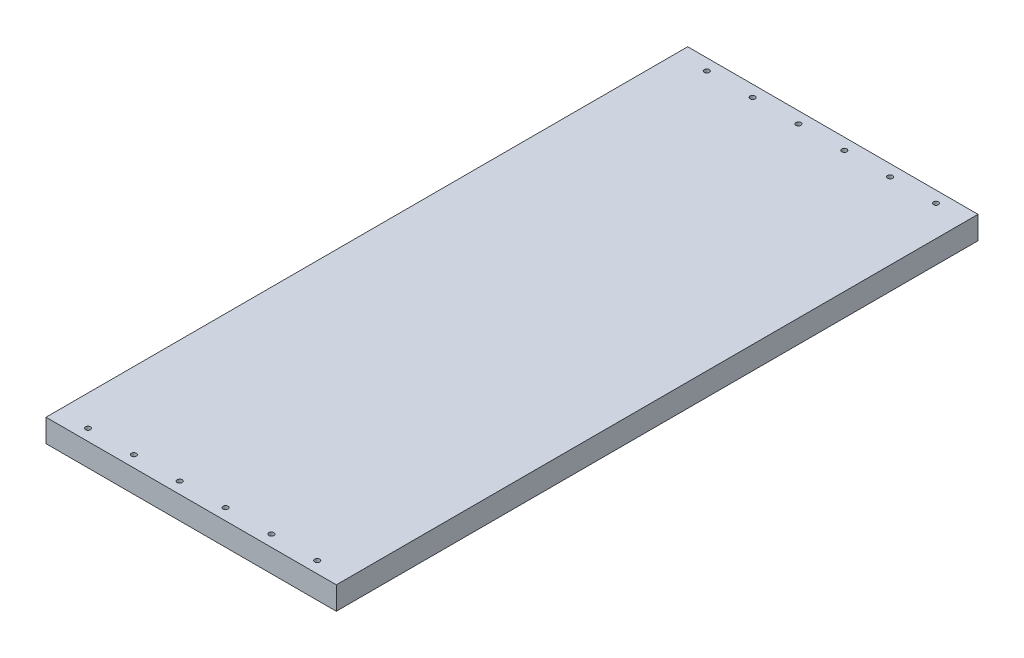
ISO-10303-21;
HEADER;
FILE_DESCRIPTION(('STEP AP214'),'2;1');
FILE_NAME('part.step','',(''),(''),'','','');
FILE_SCHEMA(('AUTOMOTIVE_DESIGN { 1 0 10303 214 1 1 1 1 }'));
ENDSEC;
DATA;
#1=APPLICATION_CONTEXT('core data for automotive mechanical design processes');
#2=APPLICATION_PROTOCOL_DEFINITION('international standard','automotive_design',2000,#1);
#3=PRODUCT_CONTEXT('',#1,'mechanical');
#4=PRODUCT('Part','Part','',(#3));
#5=PRODUCT_RELATED_PRODUCT_CATEGORY('part','',(#4));
#6=PRODUCT_DEFINITION_FORMATION('','',#4);
#7=PRODUCT_DEFINITION_CONTEXT('part definition',#1,'design');
#8=PRODUCT_DEFINITION('design','',#6,#7);
#9=PRODUCT_DEFINITION_SHAPE('','',#8);
#10=(LENGTH_UNIT() NAMED_UNIT(*) SI_UNIT(.MILLI.,.METRE.));
#11=(NAMED_UNIT(*) PLANE_ANGLE_UNIT() SI_UNIT($,.RADIAN.));
#12=(NAMED_UNIT(*) SI_UNIT($,.STERADIAN.) SOLID_ANGLE_UNIT());
#13=UNCERTAINTY_MEASURE_WITH_UNIT(LENGTH_MEASURE(1.E-05),#10,'distance_accuracy_value','');
#14=(GEOMETRIC_REPRESENTATION_CONTEXT(3) GLOBAL_UNCERTAINTY_ASSIGNED_CONTEXT((#13)) GLOBAL_UNIT_ASSIGNED_CONTEXT((#10,
#11,#12)) REPRESENTATION_CONTEXT('',''));
#15=CARTESIAN_POINT('',(0.,0.,0.));
#16=DIRECTION('',(0.,0.,1.));
#17=DIRECTION('',(1.,0.,0.));
#18=AXIS2_PLACEMENT_3D('',#15,#16,#17);
#19=CARTESIAN_POINT('',(-241.3,-19.05,1066.8));
#20=DIRECTION('',(1.,0.,0.));
#21=DIRECTION('',(0.,0.,-1.));
#22=AXIS2_PLACEMENT_3D('',#19,#20,#21);
#23=PLANE('',#22);
#24=DIRECTION('',(0.,-1.,0.));
#25=VECTOR('',#24,1.);
#26=CARTESIAN_POINT('',(-241.3,-19.05,0.));
#27=LINE('',#26,#25);
#28=CARTESIAN_POINT('',(-241.3,19.05,0.));
#29=VERTEX_POINT('',#28);
#30=CARTESIAN_POINT('',(-241.3,-19.05,0.));
#31=VERTEX_POINT('',#30);
#32=EDGE_CURVE('E99',#29,#31,#27,.T.);
#33=ORIENTED_EDGE('',*,*,#32,.T.);
#34=DIRECTION('',(0.,0.,-1.));
#35=VECTOR('',#34,1.);
#36=CARTESIAN_POINT('',(-241.3,-19.05,1066.8));
#37=LINE('',#36,#35);
#38=CARTESIAN_POINT('',(-241.3,-19.05,1066.8));
#39=VERTEX_POINT('',#38);
#40=EDGE_CURVE('E11',#39,#31,#37,.T.);
#41=ORIENTED_EDGE('',*,*,#40,.F.);
#42=DIRECTION('',(0.,-1.,0.));
#43=VECTOR('',#42,1.);
#44=CARTESIAN_POINT('',(-241.3,-19.05,1066.8));
#45=LINE('',#44,#43);
#46=CARTESIAN_POINT('',(-241.3,19.05,1066.8));
#47=VERTEX_POINT('',#46);
#48=EDGE_CURVE('E87',#47,#39,#45,.T.);
#49=ORIENTED_EDGE('',*,*,#48,.F.);
#50=DIRECTION('',(0.,0.,-1.));
#51=VECTOR('',#50,1.);
#52=CARTESIAN_POINT('',(-241.3,19.05,1066.8));
#53=LINE('',#52,#51);
#54=EDGE_CURVE('E95',#47,#29,#53,.T.);
#55=ORIENTED_EDGE('',*,*,#54,.T.);
#56=EDGE_LOOP('',(#33,#41,#49,#55));
#57=FACE_BOUND('',#56,.T.);
#58=ADVANCED_FACE('F36',(#57),#23,.F.);
#59=CARTESIAN_POINT('',(241.3,-19.05,1066.8));
#60=DIRECTION('',(0.,1.,0.));
#61=DIRECTION('',(0.,0.,1.));
#62=AXIS2_PLACEMENT_3D('',#59,#60,#61);
#63=PLANE('',#62);
#64=CARTESIAN_POINT('',(-190.5,-19.05,1047.75));
#65=DIRECTION('',(0.,-1.,0.));
#66=DIRECTION('',(0.,0.,-1.));
#67=AXIS2_PLACEMENT_3D('',#64,#65,#66);
#68=CIRCLE('',#67,8.0645);
#69=CARTESIAN_POINT('',(-190.5,-19.05,1039.6855));
#70=VERTEX_POINT('',#69);
#71=EDGE_CURVE('E217',#70,#70,#68,.T.);
#72=ORIENTED_EDGE('',*,*,#71,.F.);
#73=EDGE_LOOP('',(#72));
#74=FACE_BOUND('',#73,.T.);
#75=CARTESIAN_POINT('',(-114.3,-19.05,1047.75));
#76=DIRECTION('',(0.,-1.,0.));
#77=DIRECTION('',(0.,0.,-1.));
#78=AXIS2_PLACEMENT_3D('',#75,#76,#77);
#79=CIRCLE('',#78,8.0645);
#80=CARTESIAN_POINT('',(-114.3,-19.05,1039.6855));
#81=VERTEX_POINT('',#80);
#82=EDGE_CURVE('E208',#81,#81,#79,.T.);
#83=ORIENTED_EDGE('',*,*,#82,.F.);
#84=EDGE_LOOP('',(#83));
#85=FACE_BOUND('',#84,.T.);
#86=CARTESIAN_POINT('',(-38.1000000000003,-19.05,1047.75));
#87=DIRECTION('',(0.,-1.,0.));
#88=DIRECTION('',(0.,0.,-1.));
#89=AXIS2_PLACEMENT_3D('',#86,#87,#88);
#90=CIRCLE('',#89,8.0645);
#91=CARTESIAN_POINT('',(-38.1000000000003,-19.05,1039.6855));
#92=VERTEX_POINT('',#91);
#93=EDGE_CURVE('E199',#92,#92,#90,.T.);
#94=ORIENTED_EDGE('',*,*,#93,.F.);
#95=EDGE_LOOP('',(#94));
#96=FACE_BOUND('',#95,.T.);
#97=CARTESIAN_POINT('',(38.0999999999997,-19.05,1047.75));
#98=DIRECTION('',(0.,-1.,0.));
#99=DIRECTION('',(0.,0.,-1.));
#100=AXIS2_PLACEMENT_3D('',#97,#98,#99);
#101=CIRCLE('',#100,8.0645);
#102=CARTESIAN_POINT('',(38.0999999999997,-19.05,1039.6855));
#103=VERTEX_POINT('',#102);
#104=EDGE_CURVE('E190',#103,#103,#101,.T.);
#105=ORIENTED_EDGE('',*,*,#104,.F.);
#106=EDGE_LOOP('',(#105));
#107=FACE_BOUND('',#106,.T.);
#108=CARTESIAN_POINT('',(114.3,-19.05,1047.75));
#109=DIRECTION('',(0.,-1.,0.));
#110=DIRECTION('',(0.,0.,-1.));
#111=AXIS2_PLACEMENT_3D('',#108,#109,#110);
#112=CIRCLE('',#111,8.0645);
#113=CARTESIAN_POINT('',(114.3,-19.05,1039.6855));
#114=VERTEX_POINT('',#113);
#115=EDGE_CURVE('E181',#114,#114,#112,.T.);
#116=ORIENTED_EDGE('',*,*,#115,.F.);
#117=EDGE_LOOP('',(#116));
#118=FACE_BOUND('',#117,.T.);
#119=CARTESIAN_POINT('',(190.5,-19.05,1047.75));
#120=DIRECTION('',(0.,-1.,0.));
#121=DIRECTION('',(0.,0.,-1.));
#122=AXIS2_PLACEMENT_3D('',#119,#120,#121);
#123=CIRCLE('',#122,8.0645);
#124=CARTESIAN_POINT('',(190.5,-19.05,1039.6855));
#125=VERTEX_POINT('',#124);
#126=EDGE_CURVE('E172',#125,#125,#123,.T.);
#127=ORIENTED_EDGE('',*,*,#126,.F.);
#128=EDGE_LOOP('',(#127));
#129=FACE_BOUND('',#128,.T.);
#130=CARTESIAN_POINT('',(-114.299999999997,-19.05,19.0500000000006));
#131=DIRECTION('',(0.,-1.,0.));
#132=DIRECTION('',(0.,0.,-1.));
#133=AXIS2_PLACEMENT_3D('',#130,#131,#132);
#134=CIRCLE('',#133,8.0645);
#135=CARTESIAN_POINT('',(-114.299999999997,-19.05,10.9855000000006));
#136=VERTEX_POINT('',#135);
#137=EDGE_CURVE('E163',#136,#136,#134,.T.);
#138=ORIENTED_EDGE('',*,*,#137,.F.);
#139=EDGE_LOOP('',(#138));
#140=FACE_BOUND('',#139,.T.);
#141=CARTESIAN_POINT('',(-38.0999999999972,-19.05,19.0500000000011));
#142=DIRECTION('',(0.,-1.,0.));
#143=DIRECTION('',(0.,0.,-1.));
#144=AXIS2_PLACEMENT_3D('',#141,#142,#143);
#145=CIRCLE('',#144,8.0645);
#146=CARTESIAN_POINT('',(-38.0999999999972,-19.05,10.9855000000011));
#147=VERTEX_POINT('',#146);
#148=EDGE_CURVE('E154',#147,#147,#145,.T.);
#149=ORIENTED_EDGE('',*,*,#148,.F.);
#150=EDGE_LOOP('',(#149));
#151=FACE_BOUND('',#150,.T.);
#152=CARTESIAN_POINT('',(38.1000000000028,-19.05,19.0500000000016));
#153=DIRECTION('',(0.,-1.,0.));
#154=DIRECTION('',(0.,0.,-1.));
#155=AXIS2_PLACEMENT_3D('',#152,#153,#154);
#156=CIRCLE('',#155,8.0645);
#157=CARTESIAN_POINT('',(38.1000000000028,-19.05,10.9855000000016));
#158=VERTEX_POINT('',#157);
#159=EDGE_CURVE('E145',#158,#158,#156,.T.);
#160=ORIENTED_EDGE('',*,*,#159,.F.);
#161=EDGE_LOOP('',(#160));
#162=FACE_BOUND('',#161,.T.);
#163=CARTESIAN_POINT('',(114.300000000003,-19.05,19.0500000000021));
#164=DIRECTION('',(0.,-1.,0.));
#165=DIRECTION('',(0.,0.,-1.));
#166=AXIS2_PLACEMENT_3D('',#163,#164,#165);
#167=CIRCLE('',#166,8.0645);
#168=CARTESIAN_POINT('',(114.300000000003,-19.05,10.9855000000021));
#169=VERTEX_POINT('',#168);
#170=EDGE_CURVE('E136',#169,#169,#167,.T.);
#171=ORIENTED_EDGE('',*,*,#170,.F.);
#172=EDGE_LOOP('',(#171));
#173=FACE_BOUND('',#172,.T.);
#174=CARTESIAN_POINT('',(190.500000000003,-19.05,19.0500000000027));
#175=DIRECTION('',(0.,-1.,0.));
#176=DIRECTION('',(0.,0.,-1.));
#177=AXIS2_PLACEMENT_3D('',#174,#175,#176);
#178=CIRCLE('',#177,8.0645);
#179=CARTESIAN_POINT('',(190.500000000003,-19.05,10.9855000000027));
#180=VERTEX_POINT('',#179);
#181=EDGE_CURVE('E127',#180,#180,#178,.T.);
#182=ORIENTED_EDGE('',*,*,#181,.F.);
#183=EDGE_LOOP('',(#182));
#184=FACE_BOUND('',#183,.T.);
#185=CARTESIAN_POINT('',(-190.499999999997,-19.05,19.05));
#186=DIRECTION('',(0.,-1.,0.));
#187=DIRECTION('',(0.,0.,-1.));
#188=AXIS2_PLACEMENT_3D('',#185,#186,#187);
#189=CIRCLE('',#188,8.0645);
#190=CARTESIAN_POINT('',(-190.499999999997,-19.05,10.9855));
#191=VERTEX_POINT('',#190);
#192=EDGE_CURVE('E118',#191,#191,#189,.T.);
#193=ORIENTED_EDGE('',*,*,#192,.F.);
#194=EDGE_LOOP('',(#193));
#195=FACE_BOUND('',#194,.T.);
#196=DIRECTION('',(1.,0.,0.));
#197=VECTOR('',#196,1.);
#198=CARTESIAN_POINT('',(241.3,-19.05,0.));
#199=LINE('',#198,#197);
#200=CARTESIAN_POINT('',(241.3,-19.05,0.));
#201=VERTEX_POINT('',#200);
#202=EDGE_CURVE('E91',#31,#201,#199,.T.);
#203=ORIENTED_EDGE('',*,*,#202,.T.);
#204=DIRECTION('',(0.,0.,-1.));
#205=VECTOR('',#204,1.);
#206=CARTESIAN_POINT('',(241.3,-19.05,1066.8));
#207=LINE('',#206,#205);
#208=CARTESIAN_POINT('',(241.3,-19.05,1066.8));
#209=VERTEX_POINT('',#208);
#210=EDGE_CURVE('E44',#209,#201,#207,.T.);
#211=ORIENTED_EDGE('',*,*,#210,.F.);
#212=DIRECTION('',(1.,0.,0.));
#213=VECTOR('',#212,1.);
#214=CARTESIAN_POINT('',(241.3,-19.05,1066.8));
#215=LINE('',#214,#213);
#216=EDGE_CURVE('E82',#39,#209,#215,.T.);
#217=ORIENTED_EDGE('',*,*,#216,.F.);
#218=ORIENTED_EDGE('',*,*,#40,.T.);
#219=EDGE_LOOP('',(#203,#211,#217,#218));
#220=FACE_BOUND('',#219,.T.);
#221=ADVANCED_FACE('F90',(#74,#85,#96,#107,#118,#129,#140,#151,#162,#173,#184,#195,#220),#63,.F.);
#222=CARTESIAN_POINT('',(241.3,-19.05,1066.8));
#223=DIRECTION('',(-1.,0.,0.));
#224=DIRECTION('',(0.,0.,1.));
#225=AXIS2_PLACEMENT_3D('',#222,#223,#224);
#226=PLANE('',#225);
#227=DIRECTION('',(0.,1.,0.));
#228=VECTOR('',#227,1.);
#229=CARTESIAN_POINT('',(241.3,-19.05,0.));
#230=LINE('',#229,#228);
#231=CARTESIAN_POINT('',(241.3,19.05,0.));
#232=VERTEX_POINT('',#231);
#233=EDGE_CURVE('E69',#201,#232,#230,.T.);
#234=ORIENTED_EDGE('',*,*,#233,.T.);
#235=DIRECTION('',(0.,0.,-1.));
#236=VECTOR('',#235,1.);
#237=CARTESIAN_POINT('',(241.3,19.05,1066.8));
#238=LINE('',#237,#236);
#239=CARTESIAN_POINT('',(241.3,19.05,1066.8));
#240=VERTEX_POINT('',#239);
#241=EDGE_CURVE('E92',#240,#232,#238,.T.);
#242=ORIENTED_EDGE('',*,*,#241,.F.);
#243=DIRECTION('',(0.,1.,0.));
#244=VECTOR('',#243,1.);
#245=CARTESIAN_POINT('',(241.3,-19.05,1066.8));
#246=LINE('',#245,#244);
#247=EDGE_CURVE('E85',#209,#240,#246,.T.);
#248=ORIENTED_EDGE('',*,*,#247,.F.);
#249=ORIENTED_EDGE('',*,*,#210,.T.);
#250=EDGE_LOOP('',(#234,#242,#248,#249));
#251=FACE_BOUND('',#250,.T.);
#252=ADVANCED_FACE('F93',(#251),#226,.F.);
#253=CARTESIAN_POINT('',(241.3,19.05,1066.8));
#254=DIRECTION('',(0.,-1.,0.));
#255=DIRECTION('',(0.,0.,-1.));
#256=AXIS2_PLACEMENT_3D('',#253,#254,#255);
#257=PLANE('',#256);
#258=CARTESIAN_POINT('',(-190.5,19.05,1047.75));
#259=DIRECTION('',(0.,-1.,0.));
#260=DIRECTION('',(0.,0.,-1.));
#261=AXIS2_PLACEMENT_3D('',#258,#259,#260);
#262=CIRCLE('',#261,4.21639999999998);
#263=CARTESIAN_POINT('',(-190.5,19.05,1043.5336));
#264=VERTEX_POINT('',#263);
#265=EDGE_CURVE('E211',#264,#264,#262,.T.);
#266=ORIENTED_EDGE('',*,*,#265,.T.);
#267=EDGE_LOOP('',(#266));
#268=FACE_BOUND('',#267,.T.);
#269=CARTESIAN_POINT('',(-114.3,19.05,1047.75));
#270=DIRECTION('',(0.,-1.,0.));
#271=DIRECTION('',(0.,0.,-1.));
#272=AXIS2_PLACEMENT_3D('',#269,#270,#271);
#273=CIRCLE('',#272,4.21639999999999);
#274=CARTESIAN_POINT('',(-114.3,19.05,1043.5336));
#275=VERTEX_POINT('',#274);
#276=EDGE_CURVE('E202',#275,#275,#273,.T.);
#277=ORIENTED_EDGE('',*,*,#276,.T.);
#278=EDGE_LOOP('',(#277));
#279=FACE_BOUND('',#278,.T.);
#280=CARTESIAN_POINT('',(-38.1000000000003,19.05,1047.75));
#281=DIRECTION('',(0.,-1.,0.));
#282=DIRECTION('',(0.,0.,-1.));
#283=AXIS2_PLACEMENT_3D('',#280,#281,#282);
#284=CIRCLE('',#283,4.21639999999999);
#285=CARTESIAN_POINT('',(-38.1000000000003,19.05,1043.5336));
#286=VERTEX_POINT('',#285);
#287=EDGE_CURVE('E193',#286,#286,#284,.T.);
#288=ORIENTED_EDGE('',*,*,#287,.T.);
#289=EDGE_LOOP('',(#288));
#290=FACE_BOUND('',#289,.T.);
#291=CARTESIAN_POINT('',(38.0999999999997,19.05,1047.75));
#292=DIRECTION('',(0.,-1.,0.));
#293=DIRECTION('',(0.,0.,-1.));
#294=AXIS2_PLACEMENT_3D('',#291,#292,#293);
#295=CIRCLE('',#294,4.21639999999999);
#296=CARTESIAN_POINT('',(38.0999999999997,19.05,1043.5336));
#297=VERTEX_POINT('',#296);
#298=EDGE_CURVE('E184',#297,#297,#295,.T.);
#299=ORIENTED_EDGE('',*,*,#298,.T.);
#300=EDGE_LOOP('',(#299));
#301=FACE_BOUND('',#300,.T.);
#302=CARTESIAN_POINT('',(114.3,19.05,1047.75));
#303=DIRECTION('',(0.,-1.,0.));
#304=DIRECTION('',(0.,0.,-1.));
#305=AXIS2_PLACEMENT_3D('',#302,#303,#304);
#306=CIRCLE('',#305,4.21639999999999);
#307=CARTESIAN_POINT('',(114.3,19.05,1043.5336));
#308=VERTEX_POINT('',#307);
#309=EDGE_CURVE('E175',#308,#308,#306,.T.);
#310=ORIENTED_EDGE('',*,*,#309,.T.);
#311=EDGE_LOOP('',(#310));
#312=FACE_BOUND('',#311,.T.);
#313=CARTESIAN_POINT('',(190.5,19.05,1047.75));
#314=DIRECTION('',(0.,-1.,0.));
#315=DIRECTION('',(0.,0.,-1.));
#316=AXIS2_PLACEMENT_3D('',#313,#314,#315);
#317=CIRCLE('',#316,4.21639999999998);
#318=CARTESIAN_POINT('',(190.5,19.05,1043.5336));
#319=VERTEX_POINT('',#318);
#320=EDGE_CURVE('E166',#319,#319,#317,.T.);
#321=ORIENTED_EDGE('',*,*,#320,.T.);
#322=EDGE_LOOP('',(#321));
#323=FACE_BOUND('',#322,.T.);
#324=CARTESIAN_POINT('',(-114.299999999997,19.05,19.0500000000006));
#325=DIRECTION('',(0.,-1.,0.));
#326=DIRECTION('',(0.,0.,-1.));
#327=AXIS2_PLACEMENT_3D('',#324,#325,#326);
#328=CIRCLE('',#327,4.21639999999999);
#329=CARTESIAN_POINT('',(-114.299999999997,19.05,14.8336000000006));
#330=VERTEX_POINT('',#329);
#331=EDGE_CURVE('E157',#330,#330,#328,.T.);
#332=ORIENTED_EDGE('',*,*,#331,.T.);
#333=EDGE_LOOP('',(#332));
#334=FACE_BOUND('',#333,.T.);
#335=CARTESIAN_POINT('',(-38.0999999999972,19.05,19.0500000000011));
#336=DIRECTION('',(0.,-1.,0.));
#337=DIRECTION('',(0.,0.,-1.));
#338=AXIS2_PLACEMENT_3D('',#335,#336,#337);
#339=CIRCLE('',#338,4.21639999999999);
#340=CARTESIAN_POINT('',(-38.0999999999972,19.05,14.8336000000011));
#341=VERTEX_POINT('',#340);
#342=EDGE_CURVE('E148',#341,#341,#339,.T.);
#343=ORIENTED_EDGE('',*,*,#342,.T.);
#344=EDGE_LOOP('',(#343));
#345=FACE_BOUND('',#344,.T.);
#346=CARTESIAN_POINT('',(38.1000000000028,19.05,19.0500000000016));
#347=DIRECTION('',(0.,-1.,0.));
#348=DIRECTION('',(0.,0.,-1.));
#349=AXIS2_PLACEMENT_3D('',#346,#347,#348);
#350=CIRCLE('',#349,4.21639999999999);
#351=CARTESIAN_POINT('',(38.1000000000028,19.05,14.8336000000016));
#352=VERTEX_POINT('',#351);
#353=EDGE_CURVE('E139',#352,#352,#350,.T.);
#354=ORIENTED_EDGE('',*,*,#353,.T.);
#355=EDGE_LOOP('',(#354));
#356=FACE_BOUND('',#355,.T.);
#357=CARTESIAN_POINT('',(114.300000000003,19.05,19.0500000000021));
#358=DIRECTION('',(0.,-1.,0.));
#359=DIRECTION('',(0.,0.,-1.));
#360=AXIS2_PLACEMENT_3D('',#357,#358,#359);
#361=CIRCLE('',#360,4.21639999999999);
#362=CARTESIAN_POINT('',(114.300000000003,19.05,14.8336000000021));
#363=VERTEX_POINT('',#362);
#364=EDGE_CURVE('E130',#363,#363,#361,.T.);
#365=ORIENTED_EDGE('',*,*,#364,.T.);
#366=EDGE_LOOP('',(#365));
#367=FACE_BOUND('',#366,.T.);
#368=CARTESIAN_POINT('',(190.500000000003,19.05,19.0500000000027));
#369=DIRECTION('',(0.,-1.,0.));
#370=DIRECTION('',(0.,0.,-1.));
#371=AXIS2_PLACEMENT_3D('',#368,#369,#370);
#372=CIRCLE('',#371,4.21639999999998);
#373=CARTESIAN_POINT('',(190.500000000003,19.05,14.8336000000027));
#374=VERTEX_POINT('',#373);
#375=EDGE_CURVE('E121',#374,#374,#372,.T.);
#376=ORIENTED_EDGE('',*,*,#375,.T.);
#377=EDGE_LOOP('',(#376));
#378=FACE_BOUND('',#377,.T.);
#379=CARTESIAN_POINT('',(-190.499999999997,19.05,19.05));
#380=DIRECTION('',(0.,-1.,0.));
#381=DIRECTION('',(0.,0.,-1.));
#382=AXIS2_PLACEMENT_3D('',#379,#380,#381);
#383=CIRCLE('',#382,4.21639999999998);
#384=CARTESIAN_POINT('',(-190.499999999997,19.05,14.8336));
#385=VERTEX_POINT('',#384);
#386=EDGE_CURVE('E102',#385,#385,#383,.T.);
#387=ORIENTED_EDGE('',*,*,#386,.T.);
#388=EDGE_LOOP('',(#387));
#389=FACE_BOUND('',#388,.T.);
#390=DIRECTION('',(-1.,0.,0.));
#391=VECTOR('',#390,1.);
#392=CARTESIAN_POINT('',(241.3,19.05,0.));
#393=LINE('',#392,#391);
#394=EDGE_CURVE('E75',#232,#29,#393,.T.);
#395=ORIENTED_EDGE('',*,*,#394,.T.);
#396=ORIENTED_EDGE('',*,*,#54,.F.);
#397=DIRECTION('',(-1.,0.,0.));
#398=VECTOR('',#397,1.);
#399=CARTESIAN_POINT('',(241.3,19.05,1066.8));
#400=LINE('',#399,#398);
#401=EDGE_CURVE('E52',#240,#47,#400,.T.);
#402=ORIENTED_EDGE('',*,*,#401,.F.);
#403=ORIENTED_EDGE('',*,*,#241,.T.);
#404=EDGE_LOOP('',(#395,#396,#402,#403));
#405=FACE_BOUND('',#404,.T.);
#406=ADVANCED_FACE('F107',(#268,#279,#290,#301,#312,#323,#334,#345,#356,#367,#378,#389,#405),
#257,.F.);
#407=CARTESIAN_POINT('',(0.,0.,1066.8));
#408=DIRECTION('',(0.,0.,1.));
#409=DIRECTION('',(1.,0.,0.));
#410=AXIS2_PLACEMENT_3D('',#407,#408,#409);
#411=PLANE('',#410);
#412=ORIENTED_EDGE('',*,*,#48,.T.);
#413=ORIENTED_EDGE('',*,*,#216,.T.);
#414=ORIENTED_EDGE('',*,*,#247,.T.);
#415=ORIENTED_EDGE('',*,*,#401,.T.);
#416=EDGE_LOOP('',(#412,#413,#414,#415));
#417=FACE_BOUND('',#416,.T.);
#418=ADVANCED_FACE('F83',(#417),#411,.T.);
#419=CARTESIAN_POINT('',(0.,0.,0.));
#420=DIRECTION('',(0.,0.,1.));
#421=DIRECTION('',(1.,0.,0.));
#422=AXIS2_PLACEMENT_3D('',#419,#420,#421);
#423=PLANE('',#422);
#424=ORIENTED_EDGE('',*,*,#32,.F.);
#425=ORIENTED_EDGE('',*,*,#394,.F.);
#426=ORIENTED_EDGE('',*,*,#233,.F.);
#427=ORIENTED_EDGE('',*,*,#202,.F.);
#428=EDGE_LOOP('',(#424,#425,#426,#427));
#429=FACE_BOUND('',#428,.T.);
#430=ADVANCED_FACE('F110',(#429),#423,.F.);
#431=CARTESIAN_POINT('',(-190.499999999997,-19.05,19.05));
#432=DIRECTION('',(0.,-1.,0.));
#433=DIRECTION('',(0.,0.,-1.));
#434=AXIS2_PLACEMENT_3D('',#431,#432,#433);
#435=CYLINDRICAL_SURFACE('',#434,4.21639999999999);
#436=ORIENTED_EDGE('',*,*,#386,.F.);
#437=EDGE_LOOP('',(#436));
#438=FACE_BOUND('',#437,.T.);
#439=CARTESIAN_POINT('',(-190.499999999997,-14.6232673321728,19.05));
#440=DIRECTION('',(0.,-1.,0.));
#441=DIRECTION('',(0.,0.,-1.));
#442=AXIS2_PLACEMENT_3D('',#439,#440,#441);
#443=CIRCLE('',#442,4.21640000000001);
#444=CARTESIAN_POINT('',(-190.499999999997,-14.6232673321728,14.8336));
#445=VERTEX_POINT('',#444);
#446=EDGE_CURVE('E115',#445,#445,#443,.T.);
#447=ORIENTED_EDGE('',*,*,#446,.T.);
#448=EDGE_LOOP('',(#447));
#449=FACE_BOUND('',#448,.T.);
#450=ADVANCED_FACE('F250',(#438,#449),#435,.F.);
#451=CARTESIAN_POINT('',(-190.499999999997,-19.05,19.05));
#452=DIRECTION('',(0.,-1.,0.));
#453=DIRECTION('',(0.,0.,-1.));
#454=AXIS2_PLACEMENT_3D('',#451,#452,#453);
#455=CONICAL_SURFACE('',#454,8.0645,0.715584993317674);
#456=ORIENTED_EDGE('',*,*,#446,.F.);
#457=EDGE_LOOP('',(#456));
#458=FACE_BOUND('',#457,.T.);
#459=ORIENTED_EDGE('',*,*,#192,.T.);
#460=EDGE_LOOP('',(#459));
#461=FACE_BOUND('',#460,.T.);
#462=ADVANCED_FACE('F247',(#458,#461),#455,.F.);
#463=CARTESIAN_POINT('',(190.500000000003,-19.05,19.0500000000027));
#464=DIRECTION('',(0.,-1.,0.));
#465=DIRECTION('',(0.,0.,-1.));
#466=AXIS2_PLACEMENT_3D('',#463,#464,#465);
#467=CYLINDRICAL_SURFACE('',#466,4.21639999999999);
#468=ORIENTED_EDGE('',*,*,#375,.F.);
#469=EDGE_LOOP('',(#468));
#470=FACE_BOUND('',#469,.T.);
#471=CARTESIAN_POINT('',(190.500000000003,-14.6232673321728,19.0500000000027));
#472=DIRECTION('',(0.,-1.,0.));
#473=DIRECTION('',(0.,0.,-1.));
#474=AXIS2_PLACEMENT_3D('',#471,#472,#473);
#475=CIRCLE('',#474,4.21640000000001);
#476=CARTESIAN_POINT('',(190.500000000003,-14.6232673321728,14.8336000000027));
#477=VERTEX_POINT('',#476);
#478=EDGE_CURVE('E124',#477,#477,#475,.T.);
#479=ORIENTED_EDGE('',*,*,#478,.T.);
#480=EDGE_LOOP('',(#479));
#481=FACE_BOUND('',#480,.T.);
#482=ADVANCED_FACE('F249',(#470,#481),#467,.F.);
#483=CARTESIAN_POINT('',(190.500000000003,-19.05,19.0500000000027));
#484=DIRECTION('',(0.,-1.,0.));
#485=DIRECTION('',(0.,0.,-1.));
#486=AXIS2_PLACEMENT_3D('',#483,#484,#485);
#487=CONICAL_SURFACE('',#486,8.0645,0.715584993317674);
#488=ORIENTED_EDGE('',*,*,#478,.F.);
#489=EDGE_LOOP('',(#488));
#490=FACE_BOUND('',#489,.T.);
#491=ORIENTED_EDGE('',*,*,#181,.T.);
#492=EDGE_LOOP('',(#491));
#493=FACE_BOUND('',#492,.T.);
#494=ADVANCED_FACE('F257',(#490,#493),#487,.F.);
#495=CARTESIAN_POINT('',(114.300000000003,-19.05,19.0500000000021));
#496=DIRECTION('',(0.,-1.,0.));
#497=DIRECTION('',(0.,0.,-1.));
#498=AXIS2_PLACEMENT_3D('',#495,#496,#497);
#499=CYLINDRICAL_SURFACE('',#498,4.21639999999999);
#500=ORIENTED_EDGE('',*,*,#364,.F.);
#501=EDGE_LOOP('',(#500));
#502=FACE_BOUND('',#501,.T.);
#503=CARTESIAN_POINT('',(114.300000000003,-14.6232673321728,19.0500000000021));
#504=DIRECTION('',(0.,-1.,0.));
#505=DIRECTION('',(0.,0.,-1.));
#506=AXIS2_PLACEMENT_3D('',#503,#504,#505);
#507=CIRCLE('',#506,4.21639999999999);
#508=CARTESIAN_POINT('',(114.300000000003,-14.6232673321728,14.8336000000021));
#509=VERTEX_POINT('',#508);
#510=EDGE_CURVE('E133',#509,#509,#507,.T.);
#511=ORIENTED_EDGE('',*,*,#510,.T.);
#512=EDGE_LOOP('',(#511));
#513=FACE_BOUND('',#512,.T.);
#514=ADVANCED_FACE('F318',(#502,#513),#499,.F.);
#515=CARTESIAN_POINT('',(114.300000000003,-19.05,19.0500000000021));
#516=DIRECTION('',(0.,-1.,0.));
#517=DIRECTION('',(0.,0.,-1.));
#518=AXIS2_PLACEMENT_3D('',#515,#516,#517);
#519=CONICAL_SURFACE('',#518,8.0645,0.715584993317676);
#520=ORIENTED_EDGE('',*,*,#510,.F.);
#521=EDGE_LOOP('',(#520));
#522=FACE_BOUND('',#521,.T.);
#523=ORIENTED_EDGE('',*,*,#170,.T.);
#524=EDGE_LOOP('',(#523));
#525=FACE_BOUND('',#524,.T.);
#526=ADVANCED_FACE('F328',(#522,#525),#519,.F.);
#527=CARTESIAN_POINT('',(38.1000000000028,-19.05,19.0500000000016));
#528=DIRECTION('',(0.,-1.,0.));
#529=DIRECTION('',(0.,0.,-1.));
#530=AXIS2_PLACEMENT_3D('',#527,#528,#529);
#531=CYLINDRICAL_SURFACE('',#530,4.21639999999999);
#532=ORIENTED_EDGE('',*,*,#353,.F.);
#533=EDGE_LOOP('',(#532));
#534=FACE_BOUND('',#533,.T.);
#535=CARTESIAN_POINT('',(38.1000000000028,-14.6232673321728,19.0500000000016));
#536=DIRECTION('',(0.,-1.,0.));
#537=DIRECTION('',(0.,0.,-1.));
#538=AXIS2_PLACEMENT_3D('',#535,#536,#537);
#539=CIRCLE('',#538,4.21639999999999);
#540=CARTESIAN_POINT('',(38.1000000000028,-14.6232673321728,14.8336000000016));
#541=VERTEX_POINT('',#540);
#542=EDGE_CURVE('E142',#541,#541,#539,.T.);
#543=ORIENTED_EDGE('',*,*,#542,.T.);
#544=EDGE_LOOP('',(#543));
#545=FACE_BOUND('',#544,.T.);
#546=ADVANCED_FACE('F338',(#534,#545),#531,.F.);
#547=CARTESIAN_POINT('',(38.1000000000028,-19.05,19.0500000000016));
#548=DIRECTION('',(0.,-1.,0.));
#549=DIRECTION('',(0.,0.,-1.));
#550=AXIS2_PLACEMENT_3D('',#547,#548,#549);
#551=CONICAL_SURFACE('',#550,8.0645,0.715584993317676);
#552=ORIENTED_EDGE('',*,*,#542,.F.);
#553=EDGE_LOOP('',(#552));
#554=FACE_BOUND('',#553,.T.);
#555=ORIENTED_EDGE('',*,*,#159,.T.);
#556=EDGE_LOOP('',(#555));
#557=FACE_BOUND('',#556,.T.);
#558=ADVANCED_FACE('F348',(#554,#557),#551,.F.);
#559=CARTESIAN_POINT('',(-38.0999999999972,-19.05,19.0500000000011));
#560=DIRECTION('',(0.,-1.,0.));
#561=DIRECTION('',(0.,0.,-1.));
#562=AXIS2_PLACEMENT_3D('',#559,#560,#561);
#563=CYLINDRICAL_SURFACE('',#562,4.21639999999999);
#564=ORIENTED_EDGE('',*,*,#342,.F.);
#565=EDGE_LOOP('',(#564));
#566=FACE_BOUND('',#565,.T.);
#567=CARTESIAN_POINT('',(-38.0999999999972,-14.6232673321728,19.0500000000011));
#568=DIRECTION('',(0.,-1.,0.));
#569=DIRECTION('',(0.,0.,-1.));
#570=AXIS2_PLACEMENT_3D('',#567,#568,#569);
#571=CIRCLE('',#570,4.21639999999999);
#572=CARTESIAN_POINT('',(-38.0999999999972,-14.6232673321728,14.8336000000011));
#573=VERTEX_POINT('',#572);
#574=EDGE_CURVE('E151',#573,#573,#571,.T.);
#575=ORIENTED_EDGE('',*,*,#574,.T.);
#576=EDGE_LOOP('',(#575));
#577=FACE_BOUND('',#576,.T.);
#578=ADVANCED_FACE('F358',(#566,#577),#563,.F.);
#579=CARTESIAN_POINT('',(-38.0999999999972,-19.05,19.0500000000011));
#580=DIRECTION('',(0.,-1.,0.));
#581=DIRECTION('',(0.,0.,-1.));
#582=AXIS2_PLACEMENT_3D('',#579,#580,#581);
#583=CONICAL_SURFACE('',#582,8.0645,0.715584993317676);
#584=ORIENTED_EDGE('',*,*,#574,.F.);
#585=EDGE_LOOP('',(#584));
#586=FACE_BOUND('',#585,.T.);
#587=ORIENTED_EDGE('',*,*,#148,.T.);
#588=EDGE_LOOP('',(#587));
#589=FACE_BOUND('',#588,.T.);
#590=ADVANCED_FACE('F368',(#586,#589),#583,.F.);
#591=CARTESIAN_POINT('',(-114.299999999997,-19.05,19.0500000000006));
#592=DIRECTION('',(0.,-1.,0.));
#593=DIRECTION('',(0.,0.,-1.));
#594=AXIS2_PLACEMENT_3D('',#591,#592,#593);
#595=CYLINDRICAL_SURFACE('',#594,4.21639999999999);
#596=ORIENTED_EDGE('',*,*,#331,.F.);
#597=EDGE_LOOP('',(#596));
#598=FACE_BOUND('',#597,.T.);
#599=CARTESIAN_POINT('',(-114.299999999997,-14.6232673321728,19.0500000000006));
#600=DIRECTION('',(0.,-1.,0.));
#601=DIRECTION('',(0.,0.,-1.));
#602=AXIS2_PLACEMENT_3D('',#599,#600,#601);
#603=CIRCLE('',#602,4.21639999999999);
#604=CARTESIAN_POINT('',(-114.299999999997,-14.6232673321728,14.8336000000006));
#605=VERTEX_POINT('',#604);
#606=EDGE_CURVE('E160',#605,#605,#603,.T.);
#607=ORIENTED_EDGE('',*,*,#606,.T.);
#608=EDGE_LOOP('',(#607));
#609=FACE_BOUND('',#608,.T.);
#610=ADVANCED_FACE('F378',(#598,#609),#595,.F.);
#611=CARTESIAN_POINT('',(-114.299999999997,-19.05,19.0500000000006));
#612=DIRECTION('',(0.,-1.,0.));
#613=DIRECTION('',(0.,0.,-1.));
#614=AXIS2_PLACEMENT_3D('',#611,#612,#613);
#615=CONICAL_SURFACE('',#614,8.0645,0.715584993317676);
#616=ORIENTED_EDGE('',*,*,#606,.F.);
#617=EDGE_LOOP('',(#616));
#618=FACE_BOUND('',#617,.T.);
#619=ORIENTED_EDGE('',*,*,#137,.T.);
#620=EDGE_LOOP('',(#619));
#621=FACE_BOUND('',#620,.T.);
#622=ADVANCED_FACE('F388',(#618,#621),#615,.F.);
#623=CARTESIAN_POINT('',(190.5,-19.05,1047.75));
#624=DIRECTION('',(0.,-1.,0.));
#625=DIRECTION('',(0.,0.,-1.));
#626=AXIS2_PLACEMENT_3D('',#623,#624,#625);
#627=CYLINDRICAL_SURFACE('',#626,4.21639999999999);
#628=ORIENTED_EDGE('',*,*,#320,.F.);
#629=EDGE_LOOP('',(#628));
#630=FACE_BOUND('',#629,.T.);
#631=CARTESIAN_POINT('',(190.5,-14.6232673321728,1047.75));
#632=DIRECTION('',(0.,-1.,0.));
#633=DIRECTION('',(0.,0.,-1.));
#634=AXIS2_PLACEMENT_3D('',#631,#632,#633);
#635=CIRCLE('',#634,4.21640000000001);
#636=CARTESIAN_POINT('',(190.5,-14.6232673321728,1043.5336));
#637=VERTEX_POINT('',#636);
#638=EDGE_CURVE('E169',#637,#637,#635,.T.);
#639=ORIENTED_EDGE('',*,*,#638,.T.);
#640=EDGE_LOOP('',(#639));
#641=FACE_BOUND('',#640,.T.);
#642=ADVANCED_FACE('F398',(#630,#641),#627,.F.);
#643=CARTESIAN_POINT('',(190.5,-19.05,1047.75));
#644=DIRECTION('',(0.,-1.,0.));
#645=DIRECTION('',(0.,0.,-1.));
#646=AXIS2_PLACEMENT_3D('',#643,#644,#645);
#647=CONICAL_SURFACE('',#646,8.0645,0.715584993317674);
#648=ORIENTED_EDGE('',*,*,#638,.F.);
#649=EDGE_LOOP('',(#648));
#650=FACE_BOUND('',#649,.T.);
#651=ORIENTED_EDGE('',*,*,#126,.T.);
#652=EDGE_LOOP('',(#651));
#653=FACE_BOUND('',#652,.T.);
#654=ADVANCED_FACE('F408',(#650,#653),#647,.F.);
#655=CARTESIAN_POINT('',(114.3,-19.05,1047.75));
#656=DIRECTION('',(0.,-1.,0.));
#657=DIRECTION('',(0.,0.,-1.));
#658=AXIS2_PLACEMENT_3D('',#655,#656,#657);
#659=CYLINDRICAL_SURFACE('',#658,4.21639999999999);
#660=ORIENTED_EDGE('',*,*,#309,.F.);
#661=EDGE_LOOP('',(#660));
#662=FACE_BOUND('',#661,.T.);
#663=CARTESIAN_POINT('',(114.3,-14.6232673321728,1047.75));
#664=DIRECTION('',(0.,-1.,0.));
#665=DIRECTION('',(0.,0.,-1.));
#666=AXIS2_PLACEMENT_3D('',#663,#664,#665);
#667=CIRCLE('',#666,4.21639999999999);
#668=CARTESIAN_POINT('',(114.3,-14.6232673321728,1043.5336));
#669=VERTEX_POINT('',#668);
#670=EDGE_CURVE('E178',#669,#669,#667,.T.);
#671=ORIENTED_EDGE('',*,*,#670,.T.);
#672=EDGE_LOOP('',(#671));
#673=FACE_BOUND('',#672,.T.);
#674=ADVANCED_FACE('F418',(#662,#673),#659,.F.);
#675=CARTESIAN_POINT('',(114.3,-19.05,1047.75));
#676=DIRECTION('',(0.,-1.,0.));
#677=DIRECTION('',(0.,0.,-1.));
#678=AXIS2_PLACEMENT_3D('',#675,#676,#677);
#679=CONICAL_SURFACE('',#678,8.0645,0.715584993317676);
#680=ORIENTED_EDGE('',*,*,#670,.F.);
#681=EDGE_LOOP('',(#680));
#682=FACE_BOUND('',#681,.T.);
#683=ORIENTED_EDGE('',*,*,#115,.T.);
#684=EDGE_LOOP('',(#683));
#685=FACE_BOUND('',#684,.T.);
#686=ADVANCED_FACE('F428',(#682,#685),#679,.F.);
#687=CARTESIAN_POINT('',(38.0999999999997,-19.05,1047.75));
#688=DIRECTION('',(0.,-1.,0.));
#689=DIRECTION('',(0.,0.,-1.));
#690=AXIS2_PLACEMENT_3D('',#687,#688,#689);
#691=CYLINDRICAL_SURFACE('',#690,4.21639999999999);
#692=ORIENTED_EDGE('',*,*,#298,.F.);
#693=EDGE_LOOP('',(#692));
#694=FACE_BOUND('',#693,.T.);
#695=CARTESIAN_POINT('',(38.0999999999997,-14.6232673321728,1047.75));
#696=DIRECTION('',(0.,-1.,0.));
#697=DIRECTION('',(0.,0.,-1.));
#698=AXIS2_PLACEMENT_3D('',#695,#696,#697);
#699=CIRCLE('',#698,4.21639999999999);
#700=CARTESIAN_POINT('',(38.0999999999997,-14.6232673321728,1043.5336));
#701=VERTEX_POINT('',#700);
#702=EDGE_CURVE('E187',#701,#701,#699,.T.);
#703=ORIENTED_EDGE('',*,*,#702,.T.);
#704=EDGE_LOOP('',(#703));
#705=FACE_BOUND('',#704,.T.);
#706=ADVANCED_FACE('F438',(#694,#705),#691,.F.);
#707=CARTESIAN_POINT('',(38.0999999999997,-19.05,1047.75));
#708=DIRECTION('',(0.,-1.,0.));
#709=DIRECTION('',(0.,0.,-1.));
#710=AXIS2_PLACEMENT_3D('',#707,#708,#709);
#711=CONICAL_SURFACE('',#710,8.0645,0.715584993317676);
#712=ORIENTED_EDGE('',*,*,#702,.F.);
#713=EDGE_LOOP('',(#712));
#714=FACE_BOUND('',#713,.T.);
#715=ORIENTED_EDGE('',*,*,#104,.T.);
#716=EDGE_LOOP('',(#715));
#717=FACE_BOUND('',#716,.T.);
#718=ADVANCED_FACE('F448',(#714,#717),#711,.F.);
#719=CARTESIAN_POINT('',(-38.1000000000003,-19.05,1047.75));
#720=DIRECTION('',(0.,-1.,0.));
#721=DIRECTION('',(0.,0.,-1.));
#722=AXIS2_PLACEMENT_3D('',#719,#720,#721);
#723=CYLINDRICAL_SURFACE('',#722,4.21639999999999);
#724=ORIENTED_EDGE('',*,*,#287,.F.);
#725=EDGE_LOOP('',(#724));
#726=FACE_BOUND('',#725,.T.);
#727=CARTESIAN_POINT('',(-38.1000000000003,-14.6232673321728,1047.75));
#728=DIRECTION('',(0.,-1.,0.));
#729=DIRECTION('',(0.,0.,-1.));
#730=AXIS2_PLACEMENT_3D('',#727,#728,#729);
#731=CIRCLE('',#730,4.21639999999999);
#732=CARTESIAN_POINT('',(-38.1000000000003,-14.6232673321728,1043.5336));
#733=VERTEX_POINT('',#732);
#734=EDGE_CURVE('E196',#733,#733,#731,.T.);
#735=ORIENTED_EDGE('',*,*,#734,.T.);
#736=EDGE_LOOP('',(#735));
#737=FACE_BOUND('',#736,.T.);
#738=ADVANCED_FACE('F458',(#726,#737),#723,.F.);
#739=CARTESIAN_POINT('',(-38.1000000000003,-19.05,1047.75));
#740=DIRECTION('',(0.,-1.,0.));
#741=DIRECTION('',(0.,0.,-1.));
#742=AXIS2_PLACEMENT_3D('',#739,#740,#741);
#743=CONICAL_SURFACE('',#742,8.0645,0.715584993317676);
#744=ORIENTED_EDGE('',*,*,#734,.F.);
#745=EDGE_LOOP('',(#744));
#746=FACE_BOUND('',#745,.T.);
#747=ORIENTED_EDGE('',*,*,#93,.T.);
#748=EDGE_LOOP('',(#747));
#749=FACE_BOUND('',#748,.T.);
#750=ADVANCED_FACE('F468',(#746,#749),#743,.F.);
#751=CARTESIAN_POINT('',(-114.3,-19.05,1047.75));
#752=DIRECTION('',(0.,-1.,0.));
#753=DIRECTION('',(0.,0.,-1.));
#754=AXIS2_PLACEMENT_3D('',#751,#752,#753);
#755=CYLINDRICAL_SURFACE('',#754,4.21639999999999);
#756=ORIENTED_EDGE('',*,*,#276,.F.);
#757=EDGE_LOOP('',(#756));
#758=FACE_BOUND('',#757,.T.);
#759=CARTESIAN_POINT('',(-114.3,-14.6232673321728,1047.75));
#760=DIRECTION('',(0.,-1.,0.));
#761=DIRECTION('',(0.,0.,-1.));
#762=AXIS2_PLACEMENT_3D('',#759,#760,#761);
#763=CIRCLE('',#762,4.21639999999999);
#764=CARTESIAN_POINT('',(-114.3,-14.6232673321728,1043.5336));
#765=VERTEX_POINT('',#764);
#766=EDGE_CURVE('E205',#765,#765,#763,.T.);
#767=ORIENTED_EDGE('',*,*,#766,.T.);
#768=EDGE_LOOP('',(#767));
#769=FACE_BOUND('',#768,.T.);
#770=ADVANCED_FACE('F478',(#758,#769),#755,.F.);
#771=CARTESIAN_POINT('',(-114.3,-19.05,1047.75));
#772=DIRECTION('',(0.,-1.,0.));
#773=DIRECTION('',(0.,0.,-1.));
#774=AXIS2_PLACEMENT_3D('',#771,#772,#773);
#775=CONICAL_SURFACE('',#774,8.0645,0.715584993317676);
#776=ORIENTED_EDGE('',*,*,#766,.F.);
#777=EDGE_LOOP('',(#776));
#778=FACE_BOUND('',#777,.T.);
#779=ORIENTED_EDGE('',*,*,#82,.T.);
#780=EDGE_LOOP('',(#779));
#781=FACE_BOUND('',#780,.T.);
#782=ADVANCED_FACE('F488',(#778,#781),#775,.F.);
#783=CARTESIAN_POINT('',(-190.5,-19.05,1047.75));
#784=DIRECTION('',(0.,-1.,0.));
#785=DIRECTION('',(0.,0.,-1.));
#786=AXIS2_PLACEMENT_3D('',#783,#784,#785);
#787=CYLINDRICAL_SURFACE('',#786,4.21639999999999);
#788=ORIENTED_EDGE('',*,*,#265,.F.);
#789=EDGE_LOOP('',(#788));
#790=FACE_BOUND('',#789,.T.);
#791=CARTESIAN_POINT('',(-190.5,-14.6232673321728,1047.75));
#792=DIRECTION('',(0.,-1.,0.));
#793=DIRECTION('',(0.,0.,-1.));
#794=AXIS2_PLACEMENT_3D('',#791,#792,#793);
#795=CIRCLE('',#794,4.21640000000001);
#796=CARTESIAN_POINT('',(-190.5,-14.6232673321728,1043.5336));
#797=VERTEX_POINT('',#796);
#798=EDGE_CURVE('E214',#797,#797,#795,.T.);
#799=ORIENTED_EDGE('',*,*,#798,.T.);
#800=EDGE_LOOP('',(#799));
#801=FACE_BOUND('',#800,.T.);
#802=ADVANCED_FACE('F498',(#790,#801),#787,.F.);
#803=CARTESIAN_POINT('',(-190.5,-19.05,1047.75));
#804=DIRECTION('',(0.,-1.,0.));
#805=DIRECTION('',(0.,0.,-1.));
#806=AXIS2_PLACEMENT_3D('',#803,#804,#805);
#807=CONICAL_SURFACE('',#806,8.0645,0.715584993317674);
#808=ORIENTED_EDGE('',*,*,#798,.F.);
#809=EDGE_LOOP('',(#808));
#810=FACE_BOUND('',#809,.T.);
#811=ORIENTED_EDGE('',*,*,#71,.T.);
#812=EDGE_LOOP('',(#811));
#813=FACE_BOUND('',#812,.T.);
#814=ADVANCED_FACE('F221',(#810,#813),#807,.F.);
#815=CLOSED_SHELL('',(#58,#221,#252,#406,#418,#430,#450,#462,#482,#494,#514,#526,#546,#558,#578,
#590,#610,#622,#642,#654,#674,#686,#706,#718,#738,#750,#770,#782,#802,#814));
#816=MANIFOLD_SOLID_BREP('B2',#815);
#817=ADVANCED_BREP_SHAPE_REPRESENTATION('',(#18,#816),#14);
#818=SHAPE_DEFINITION_REPRESENTATION(#9,#817);
ENDSEC;
END-ISO-10303-21;
